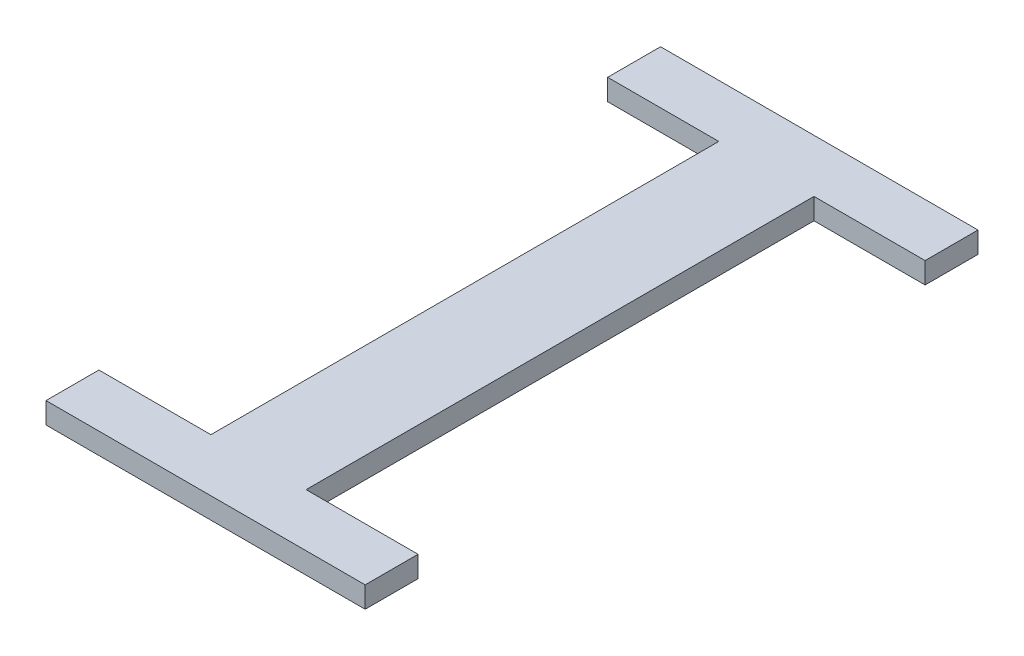
ISO-10303-21;
HEADER;
FILE_DESCRIPTION(('STEP AP214'),'2;1');
FILE_NAME('part.step','',(''),(''),'','','');
FILE_SCHEMA(('AUTOMOTIVE_DESIGN { 1 0 10303 214 1 1 1 1 }'));
ENDSEC;
DATA;
#1=APPLICATION_CONTEXT('core data for automotive mechanical design processes');
#2=APPLICATION_PROTOCOL_DEFINITION('international standard','automotive_design',2000,#1);
#3=PRODUCT_CONTEXT('',#1,'mechanical');
#4=PRODUCT('Part','Part','',(#3));
#5=PRODUCT_RELATED_PRODUCT_CATEGORY('part','',(#4));
#6=PRODUCT_DEFINITION_FORMATION('','',#4);
#7=PRODUCT_DEFINITION_CONTEXT('part definition',#1,'design');
#8=PRODUCT_DEFINITION('design','',#6,#7);
#9=PRODUCT_DEFINITION_SHAPE('','',#8);
#10=(LENGTH_UNIT() NAMED_UNIT(*) SI_UNIT(.MILLI.,.METRE.));
#11=(NAMED_UNIT(*) PLANE_ANGLE_UNIT() SI_UNIT($,.RADIAN.));
#12=(NAMED_UNIT(*) SI_UNIT($,.STERADIAN.) SOLID_ANGLE_UNIT());
#13=UNCERTAINTY_MEASURE_WITH_UNIT(LENGTH_MEASURE(1.E-05),#10,'distance_accuracy_value','');
#14=(GEOMETRIC_REPRESENTATION_CONTEXT(3) GLOBAL_UNCERTAINTY_ASSIGNED_CONTEXT((#13)) GLOBAL_UNIT_ASSIGNED_CONTEXT((#10,
#11,#12)) REPRESENTATION_CONTEXT('',''));
#15=CARTESIAN_POINT('',(0.,0.,0.));
#16=DIRECTION('',(0.,0.,1.));
#17=DIRECTION('',(1.,0.,0.));
#18=AXIS2_PLACEMENT_3D('',#15,#16,#17);
#19=CARTESIAN_POINT('',(-155.,10.,145.));
#20=DIRECTION('',(0.,0.,-1.));
#21=DIRECTION('',(-1.,0.,0.));
#22=AXIS2_PLACEMENT_3D('',#19,#20,#21);
#23=PLANE('',#22);
#24=DIRECTION('',(1.,0.,0.));
#25=VECTOR('',#24,1.);
#26=CARTESIAN_POINT('',(-155.,10.,145.));
#27=LINE('',#26,#25);
#28=CARTESIAN_POINT('',(-75.4079794468563,10.,145.));
#29=VERTEX_POINT('',#28);
#30=CARTESIAN_POINT('',(75.4079794468563,10.,145.));
#31=VERTEX_POINT('',#30);
#32=EDGE_CURVE('E11',#29,#31,#27,.T.);
#33=ORIENTED_EDGE('',*,*,#32,.F.);
#34=DIRECTION('',(0.,-1.,0.));
#35=VECTOR('',#34,1.);
#36=CARTESIAN_POINT('',(-75.4079794468563,10.,145.));
#37=LINE('',#36,#35);
#38=CARTESIAN_POINT('',(-75.4079794468563,0.,145.));
#39=VERTEX_POINT('',#38);
#40=EDGE_CURVE('E158',#29,#39,#37,.T.);
#41=ORIENTED_EDGE('',*,*,#40,.T.);
#42=DIRECTION('',(1.,0.,0.));
#43=VECTOR('',#42,1.);
#44=CARTESIAN_POINT('',(-155.,0.,145.));
#45=LINE('',#44,#43);
#46=CARTESIAN_POINT('',(75.4079794468563,0.,145.));
#47=VERTEX_POINT('',#46);
#48=EDGE_CURVE('E44',#39,#47,#45,.T.);
#49=ORIENTED_EDGE('',*,*,#48,.T.);
#50=DIRECTION('',(0.,-1.,0.));
#51=VECTOR('',#50,1.);
#52=CARTESIAN_POINT('',(75.4079794468563,10.,145.));
#53=LINE('',#52,#51);
#54=EDGE_CURVE('E177',#31,#47,#53,.T.);
#55=ORIENTED_EDGE('',*,*,#54,.F.);
#56=EDGE_LOOP('',(#33,#41,#49,#55));
#57=FACE_BOUND('',#56,.T.);
#58=ADVANCED_FACE('F41',(#57),#23,.F.);
#59=CARTESIAN_POINT('',(-155.,10.,-145.));
#60=DIRECTION('',(0.,0.,1.));
#61=DIRECTION('',(1.,0.,0.));
#62=AXIS2_PLACEMENT_3D('',#59,#60,#61);
#63=PLANE('',#62);
#64=DIRECTION('',(0.,-1.,0.));
#65=VECTOR('',#64,1.);
#66=CARTESIAN_POINT('',(-75.0000001241603,10.,-145.));
#67=LINE('',#66,#65);
#68=CARTESIAN_POINT('',(-75.0000001241603,10.,-145.));
#69=VERTEX_POINT('',#68);
#70=CARTESIAN_POINT('',(-75.0000001241603,0.,-145.));
#71=VERTEX_POINT('',#70);
#72=EDGE_CURVE('E131',#69,#71,#67,.T.);
#73=ORIENTED_EDGE('',*,*,#72,.F.);
#74=DIRECTION('',(-1.,0.,0.));
#75=VECTOR('',#74,1.);
#76=CARTESIAN_POINT('',(-155.,10.,-145.));
#77=LINE('',#76,#75);
#78=CARTESIAN_POINT('',(75.0000001241603,10.,-145.));
#79=VERTEX_POINT('',#78);
#80=EDGE_CURVE('E49',#79,#69,#77,.T.);
#81=ORIENTED_EDGE('',*,*,#80,.F.);
#82=DIRECTION('',(0.,-1.,0.));
#83=VECTOR('',#82,1.);
#84=CARTESIAN_POINT('',(75.0000001241603,10.,-145.));
#85=LINE('',#84,#83);
#86=CARTESIAN_POINT('',(75.0000001241603,0.,-145.));
#87=VERTEX_POINT('',#86);
#88=EDGE_CURVE('E176',#79,#87,#85,.T.);
#89=ORIENTED_EDGE('',*,*,#88,.T.);
#90=DIRECTION('',(-1.,0.,0.));
#91=VECTOR('',#90,1.);
#92=CARTESIAN_POINT('',(-155.,0.,-145.));
#93=LINE('',#92,#91);
#94=EDGE_CURVE('E150',#87,#71,#93,.T.);
#95=ORIENTED_EDGE('',*,*,#94,.T.);
#96=EDGE_LOOP('',(#73,#81,#89,#95));
#97=FACE_BOUND('',#96,.T.);
#98=ADVANCED_FACE('F43',(#97),#63,.F.);
#99=CARTESIAN_POINT('',(0.,10.,0.));
#100=DIRECTION('',(0.,1.,0.));
#101=DIRECTION('',(0.,0.,1.));
#102=AXIS2_PLACEMENT_3D('',#99,#100,#101);
#103=PLANE('',#102);
#104=DIRECTION('',(-1.,0.,0.));
#105=VECTOR('',#104,1.);
#106=CARTESIAN_POINT('',(-75.4079794468563,10.,120.));
#107=LINE('',#106,#105);
#108=CARTESIAN_POINT('',(-22.5000001241603,10.,120.));
#109=VERTEX_POINT('',#108);
#110=CARTESIAN_POINT('',(-75.4079794468563,10.,120.));
#111=VERTEX_POINT('',#110);
#112=EDGE_CURVE('E249',#109,#111,#107,.T.);
#113=ORIENTED_EDGE('',*,*,#112,.T.);
#114=DIRECTION('',(0.,0.,1.));
#115=VECTOR('',#114,1.);
#116=CARTESIAN_POINT('',(-75.4079794468563,10.,145.));
#117=LINE('',#116,#115);
#118=EDGE_CURVE('E149',#111,#29,#117,.T.);
#119=ORIENTED_EDGE('',*,*,#118,.T.);
#120=ORIENTED_EDGE('',*,*,#32,.T.);
#121=DIRECTION('',(0.,0.,-1.));
#122=VECTOR('',#121,1.);
#123=CARTESIAN_POINT('',(75.4079794468563,10.,145.));
#124=LINE('',#123,#122);
#125=CARTESIAN_POINT('',(75.4079794468563,10.,120.));
#126=VERTEX_POINT('',#125);
#127=EDGE_CURVE('E210',#31,#126,#124,.T.);
#128=ORIENTED_EDGE('',*,*,#127,.T.);
#129=DIRECTION('',(-1.,0.,0.));
#130=VECTOR('',#129,1.);
#131=CARTESIAN_POINT('',(75.4079794468563,10.,120.));
#132=LINE('',#131,#130);
#133=CARTESIAN_POINT('',(22.5000001241603,10.,120.));
#134=VERTEX_POINT('',#133);
#135=EDGE_CURVE('E203',#126,#134,#132,.T.);
#136=ORIENTED_EDGE('',*,*,#135,.T.);
#137=DIRECTION('',(0.,0.,-1.));
#138=VECTOR('',#137,1.);
#139=CARTESIAN_POINT('',(22.5000001241603,10.,-120.));
#140=LINE('',#139,#138);
#141=CARTESIAN_POINT('',(22.5000001241603,10.,-120.));
#142=VERTEX_POINT('',#141);
#143=EDGE_CURVE('E204',#134,#142,#140,.T.);
#144=ORIENTED_EDGE('',*,*,#143,.T.);
#145=DIRECTION('',(1.,0.,0.));
#146=VECTOR('',#145,1.);
#147=CARTESIAN_POINT('',(75.0000001241603,10.,-120.));
#148=LINE('',#147,#146);
#149=CARTESIAN_POINT('',(75.0000001241603,10.,-120.));
#150=VERTEX_POINT('',#149);
#151=EDGE_CURVE('E178',#142,#150,#148,.T.);
#152=ORIENTED_EDGE('',*,*,#151,.T.);
#153=DIRECTION('',(0.,0.,-1.));
#154=VECTOR('',#153,1.);
#155=CARTESIAN_POINT('',(75.0000001241603,10.,-145.));
#156=LINE('',#155,#154);
#157=EDGE_CURVE('E152',#150,#79,#156,.T.);
#158=ORIENTED_EDGE('',*,*,#157,.T.);
#159=ORIENTED_EDGE('',*,*,#80,.T.);
#160=DIRECTION('',(0.,0.,1.));
#161=VECTOR('',#160,1.);
#162=CARTESIAN_POINT('',(-75.0000001241603,10.,-145.));
#163=LINE('',#162,#161);
#164=CARTESIAN_POINT('',(-75.0000001241603,10.,-120.));
#165=VERTEX_POINT('',#164);
#166=EDGE_CURVE('E128',#69,#165,#163,.T.);
#167=ORIENTED_EDGE('',*,*,#166,.T.);
#168=DIRECTION('',(1.,0.,0.));
#169=VECTOR('',#168,1.);
#170=CARTESIAN_POINT('',(-75.0000001241603,10.,-120.));
#171=LINE('',#170,#169);
#172=CARTESIAN_POINT('',(-22.5000001241603,10.,-120.));
#173=VERTEX_POINT('',#172);
#174=EDGE_CURVE('E136',#165,#173,#171,.T.);
#175=ORIENTED_EDGE('',*,*,#174,.T.);
#176=DIRECTION('',(0.,0.,1.));
#177=VECTOR('',#176,1.);
#178=CARTESIAN_POINT('',(-22.5000001241603,10.,-120.));
#179=LINE('',#178,#177);
#180=EDGE_CURVE('E255',#173,#109,#179,.T.);
#181=ORIENTED_EDGE('',*,*,#180,.T.);
#182=EDGE_LOOP('',(#113,#119,#120,#128,#136,#144,#152,#158,#159,#167,#175,#181));
#183=FACE_BOUND('',#182,.T.);
#184=ADVANCED_FACE('F155',(#183),#103,.T.);
#185=CARTESIAN_POINT('',(0.,0.,0.));
#186=DIRECTION('',(0.,1.,0.));
#187=DIRECTION('',(0.,0.,1.));
#188=AXIS2_PLACEMENT_3D('',#185,#186,#187);
#189=PLANE('',#188);
#190=DIRECTION('',(0.,0.,1.));
#191=VECTOR('',#190,1.);
#192=CARTESIAN_POINT('',(-75.0000001241603,0.,-145.));
#193=LINE('',#192,#191);
#194=CARTESIAN_POINT('',(-75.0000001241603,0.,-120.));
#195=VERTEX_POINT('',#194);
#196=EDGE_CURVE('E59',#71,#195,#193,.T.);
#197=ORIENTED_EDGE('',*,*,#196,.F.);
#198=ORIENTED_EDGE('',*,*,#94,.F.);
#199=DIRECTION('',(0.,0.,-1.));
#200=VECTOR('',#199,1.);
#201=CARTESIAN_POINT('',(75.0000001241603,0.,-145.));
#202=LINE('',#201,#200);
#203=CARTESIAN_POINT('',(75.0000001241603,0.,-120.));
#204=VERTEX_POINT('',#203);
#205=EDGE_CURVE('E199',#204,#87,#202,.T.);
#206=ORIENTED_EDGE('',*,*,#205,.F.);
#207=DIRECTION('',(1.,0.,0.));
#208=VECTOR('',#207,1.);
#209=CARTESIAN_POINT('',(75.0000001241603,0.,-120.));
#210=LINE('',#209,#208);
#211=CARTESIAN_POINT('',(22.5000001241603,0.,-120.));
#212=VERTEX_POINT('',#211);
#213=EDGE_CURVE('E186',#212,#204,#210,.T.);
#214=ORIENTED_EDGE('',*,*,#213,.F.);
#215=DIRECTION('',(0.,0.,-1.));
#216=VECTOR('',#215,1.);
#217=CARTESIAN_POINT('',(22.5000001241603,0.,-120.));
#218=LINE('',#217,#216);
#219=CARTESIAN_POINT('',(22.5000001241603,0.,120.));
#220=VERTEX_POINT('',#219);
#221=EDGE_CURVE('E195',#220,#212,#218,.T.);
#222=ORIENTED_EDGE('',*,*,#221,.F.);
#223=DIRECTION('',(-1.,0.,0.));
#224=VECTOR('',#223,1.);
#225=CARTESIAN_POINT('',(75.4079794468563,0.,120.));
#226=LINE('',#225,#224);
#227=CARTESIAN_POINT('',(75.4079794468563,0.,120.));
#228=VERTEX_POINT('',#227);
#229=EDGE_CURVE('E193',#228,#220,#226,.T.);
#230=ORIENTED_EDGE('',*,*,#229,.F.);
#231=DIRECTION('',(0.,0.,-1.));
#232=VECTOR('',#231,1.);
#233=CARTESIAN_POINT('',(75.4079794468563,0.,145.));
#234=LINE('',#233,#232);
#235=EDGE_CURVE('E68',#47,#228,#234,.T.);
#236=ORIENTED_EDGE('',*,*,#235,.F.);
#237=ORIENTED_EDGE('',*,*,#48,.F.);
#238=DIRECTION('',(0.,0.,1.));
#239=VECTOR('',#238,1.);
#240=CARTESIAN_POINT('',(-75.4079794468563,0.,145.));
#241=LINE('',#240,#239);
#242=CARTESIAN_POINT('',(-75.4079794468563,0.,120.));
#243=VERTEX_POINT('',#242);
#244=EDGE_CURVE('E138',#243,#39,#241,.T.);
#245=ORIENTED_EDGE('',*,*,#244,.F.);
#246=DIRECTION('',(-1.,0.,0.));
#247=VECTOR('',#246,1.);
#248=CARTESIAN_POINT('',(-75.4079794468563,0.,120.));
#249=LINE('',#248,#247);
#250=CARTESIAN_POINT('',(-22.5000001241603,0.,120.));
#251=VERTEX_POINT('',#250);
#252=EDGE_CURVE('E245',#251,#243,#249,.T.);
#253=ORIENTED_EDGE('',*,*,#252,.F.);
#254=DIRECTION('',(0.,0.,1.));
#255=VECTOR('',#254,1.);
#256=CARTESIAN_POINT('',(-22.5000001241603,0.,-120.));
#257=LINE('',#256,#255);
#258=CARTESIAN_POINT('',(-22.5000001241603,0.,-120.));
#259=VERTEX_POINT('',#258);
#260=EDGE_CURVE('E236',#259,#251,#257,.T.);
#261=ORIENTED_EDGE('',*,*,#260,.F.);
#262=DIRECTION('',(1.,0.,0.));
#263=VECTOR('',#262,1.);
#264=CARTESIAN_POINT('',(-75.0000001241603,0.,-120.));
#265=LINE('',#264,#263);
#266=EDGE_CURVE('E234',#195,#259,#265,.T.);
#267=ORIENTED_EDGE('',*,*,#266,.F.);
#268=EDGE_LOOP('',(#197,#198,#206,#214,#222,#230,#236,#237,#245,#253,#261,#267));
#269=FACE_BOUND('',#268,.T.);
#270=ADVANCED_FACE('F213',(#269),#189,.F.);
#271=CARTESIAN_POINT('',(75.0000001241603,10.,-145.));
#272=DIRECTION('',(-1.,0.,0.));
#273=DIRECTION('',(0.,0.,1.));
#274=AXIS2_PLACEMENT_3D('',#271,#272,#273);
#275=PLANE('',#274);
#276=ORIENTED_EDGE('',*,*,#205,.T.);
#277=ORIENTED_EDGE('',*,*,#88,.F.);
#278=ORIENTED_EDGE('',*,*,#157,.F.);
#279=DIRECTION('',(0.,-1.,0.));
#280=VECTOR('',#279,1.);
#281=CARTESIAN_POINT('',(75.0000001241603,10.,-120.));
#282=LINE('',#281,#280);
#283=EDGE_CURVE('E190',#150,#204,#282,.T.);
#284=ORIENTED_EDGE('',*,*,#283,.T.);
#285=EDGE_LOOP('',(#276,#277,#278,#284));
#286=FACE_BOUND('',#285,.T.);
#287=ADVANCED_FACE('F229',(#286),#275,.F.);
#288=CARTESIAN_POINT('',(75.0000001241603,10.,-120.));
#289=DIRECTION('',(0.,0.,-1.));
#290=DIRECTION('',(-1.,0.,0.));
#291=AXIS2_PLACEMENT_3D('',#288,#289,#290);
#292=PLANE('',#291);
#293=ORIENTED_EDGE('',*,*,#213,.T.);
#294=ORIENTED_EDGE('',*,*,#283,.F.);
#295=ORIENTED_EDGE('',*,*,#151,.F.);
#296=DIRECTION('',(0.,-1.,0.));
#297=VECTOR('',#296,1.);
#298=CARTESIAN_POINT('',(22.5000001241603,10.,-120.));
#299=LINE('',#298,#297);
#300=EDGE_CURVE('E184',#142,#212,#299,.T.);
#301=ORIENTED_EDGE('',*,*,#300,.T.);
#302=EDGE_LOOP('',(#293,#294,#295,#301));
#303=FACE_BOUND('',#302,.T.);
#304=ADVANCED_FACE('F227',(#303),#292,.F.);
#305=CARTESIAN_POINT('',(22.5000001241603,10.,-120.));
#306=DIRECTION('',(-1.,0.,0.));
#307=DIRECTION('',(0.,0.,1.));
#308=AXIS2_PLACEMENT_3D('',#305,#306,#307);
#309=PLANE('',#308);
#310=ORIENTED_EDGE('',*,*,#221,.T.);
#311=ORIENTED_EDGE('',*,*,#300,.F.);
#312=ORIENTED_EDGE('',*,*,#143,.F.);
#313=DIRECTION('',(0.,-1.,0.));
#314=VECTOR('',#313,1.);
#315=CARTESIAN_POINT('',(22.5000001241603,10.,120.));
#316=LINE('',#315,#314);
#317=EDGE_CURVE('E182',#134,#220,#316,.T.);
#318=ORIENTED_EDGE('',*,*,#317,.T.);
#319=EDGE_LOOP('',(#310,#311,#312,#318));
#320=FACE_BOUND('',#319,.T.);
#321=ADVANCED_FACE('F221',(#320),#309,.F.);
#322=CARTESIAN_POINT('',(75.4079794468563,10.,120.));
#323=DIRECTION('',(0.,0.,1.));
#324=DIRECTION('',(1.,0.,0.));
#325=AXIS2_PLACEMENT_3D('',#322,#323,#324);
#326=PLANE('',#325);
#327=ORIENTED_EDGE('',*,*,#229,.T.);
#328=ORIENTED_EDGE('',*,*,#317,.F.);
#329=ORIENTED_EDGE('',*,*,#135,.F.);
#330=DIRECTION('',(0.,-1.,0.));
#331=VECTOR('',#330,1.);
#332=CARTESIAN_POINT('',(75.4079794468563,10.,120.));
#333=LINE('',#332,#331);
#334=EDGE_CURVE('E181',#126,#228,#333,.T.);
#335=ORIENTED_EDGE('',*,*,#334,.T.);
#336=EDGE_LOOP('',(#327,#328,#329,#335));
#337=FACE_BOUND('',#336,.T.);
#338=ADVANCED_FACE('F222',(#337),#326,.F.);
#339=CARTESIAN_POINT('',(75.4079794468563,10.,145.));
#340=DIRECTION('',(-1.,0.,0.));
#341=DIRECTION('',(0.,0.,1.));
#342=AXIS2_PLACEMENT_3D('',#339,#340,#341);
#343=PLANE('',#342);
#344=ORIENTED_EDGE('',*,*,#235,.T.);
#345=ORIENTED_EDGE('',*,*,#334,.F.);
#346=ORIENTED_EDGE('',*,*,#127,.F.);
#347=ORIENTED_EDGE('',*,*,#54,.T.);
#348=EDGE_LOOP('',(#344,#345,#346,#347));
#349=FACE_BOUND('',#348,.T.);
#350=ADVANCED_FACE('F215',(#349),#343,.F.);
#351=CARTESIAN_POINT('',(-75.4079794468563,10.,145.));
#352=DIRECTION('',(1.,0.,0.));
#353=DIRECTION('',(0.,0.,-1.));
#354=AXIS2_PLACEMENT_3D('',#351,#352,#353);
#355=PLANE('',#354);
#356=ORIENTED_EDGE('',*,*,#244,.T.);
#357=ORIENTED_EDGE('',*,*,#40,.F.);
#358=ORIENTED_EDGE('',*,*,#118,.F.);
#359=DIRECTION('',(0.,-1.,0.));
#360=VECTOR('',#359,1.);
#361=CARTESIAN_POINT('',(-75.4079794468563,10.,120.));
#362=LINE('',#361,#360);
#363=EDGE_CURVE('E162',#111,#243,#362,.T.);
#364=ORIENTED_EDGE('',*,*,#363,.T.);
#365=EDGE_LOOP('',(#356,#357,#358,#364));
#366=FACE_BOUND('',#365,.T.);
#367=ADVANCED_FACE('F246',(#366),#355,.F.);
#368=CARTESIAN_POINT('',(-75.4079794468563,10.,120.));
#369=DIRECTION('',(0.,0.,1.));
#370=DIRECTION('',(1.,0.,0.));
#371=AXIS2_PLACEMENT_3D('',#368,#369,#370);
#372=PLANE('',#371);
#373=ORIENTED_EDGE('',*,*,#252,.T.);
#374=ORIENTED_EDGE('',*,*,#363,.F.);
#375=ORIENTED_EDGE('',*,*,#112,.F.);
#376=DIRECTION('',(0.,-1.,0.));
#377=VECTOR('',#376,1.);
#378=CARTESIAN_POINT('',(-22.5000001241603,10.,120.));
#379=LINE('',#378,#377);
#380=EDGE_CURVE('E170',#109,#251,#379,.T.);
#381=ORIENTED_EDGE('',*,*,#380,.T.);
#382=EDGE_LOOP('',(#373,#374,#375,#381));
#383=FACE_BOUND('',#382,.T.);
#384=ADVANCED_FACE('F248',(#383),#372,.F.);
#385=CARTESIAN_POINT('',(-22.5000001241603,10.,-120.));
#386=DIRECTION('',(1.,0.,0.));
#387=DIRECTION('',(0.,0.,-1.));
#388=AXIS2_PLACEMENT_3D('',#385,#386,#387);
#389=PLANE('',#388);
#390=ORIENTED_EDGE('',*,*,#260,.T.);
#391=ORIENTED_EDGE('',*,*,#380,.F.);
#392=ORIENTED_EDGE('',*,*,#180,.F.);
#393=DIRECTION('',(0.,-1.,0.));
#394=VECTOR('',#393,1.);
#395=CARTESIAN_POINT('',(-22.5000001241603,10.,-120.));
#396=LINE('',#395,#394);
#397=EDGE_CURVE('E173',#173,#259,#396,.T.);
#398=ORIENTED_EDGE('',*,*,#397,.T.);
#399=EDGE_LOOP('',(#390,#391,#392,#398));
#400=FACE_BOUND('',#399,.T.);
#401=ADVANCED_FACE('F260',(#400),#389,.F.);
#402=CARTESIAN_POINT('',(-75.0000001241603,10.,-120.));
#403=DIRECTION('',(0.,0.,-1.));
#404=DIRECTION('',(-1.,0.,0.));
#405=AXIS2_PLACEMENT_3D('',#402,#403,#404);
#406=PLANE('',#405);
#407=ORIENTED_EDGE('',*,*,#266,.T.);
#408=ORIENTED_EDGE('',*,*,#397,.F.);
#409=ORIENTED_EDGE('',*,*,#174,.F.);
#410=DIRECTION('',(0.,-1.,0.));
#411=VECTOR('',#410,1.);
#412=CARTESIAN_POINT('',(-75.0000001241603,10.,-120.));
#413=LINE('',#412,#411);
#414=EDGE_CURVE('E134',#165,#195,#413,.T.);
#415=ORIENTED_EDGE('',*,*,#414,.T.);
#416=EDGE_LOOP('',(#407,#408,#409,#415));
#417=FACE_BOUND('',#416,.T.);
#418=ADVANCED_FACE('F256',(#417),#406,.F.);
#419=CARTESIAN_POINT('',(-75.0000001241603,10.,-145.));
#420=DIRECTION('',(1.,0.,0.));
#421=DIRECTION('',(0.,0.,-1.));
#422=AXIS2_PLACEMENT_3D('',#419,#420,#421);
#423=PLANE('',#422);
#424=ORIENTED_EDGE('',*,*,#196,.T.);
#425=ORIENTED_EDGE('',*,*,#414,.F.);
#426=ORIENTED_EDGE('',*,*,#166,.F.);
#427=ORIENTED_EDGE('',*,*,#72,.T.);
#428=EDGE_LOOP('',(#424,#425,#426,#427));
#429=FACE_BOUND('',#428,.T.);
#430=ADVANCED_FACE('F135',(#429),#423,.F.);
#431=CLOSED_SHELL('',(#58,#98,#184,#270,#287,#304,#321,#338,#350,#367,#384,#401,#418,#430));
#432=MANIFOLD_SOLID_BREP('B2',#431);
#433=ADVANCED_BREP_SHAPE_REPRESENTATION('',(#18,#432),#14);
#434=SHAPE_DEFINITION_REPRESENTATION(#9,#433);
ENDSEC;
END-ISO-10303-21;
